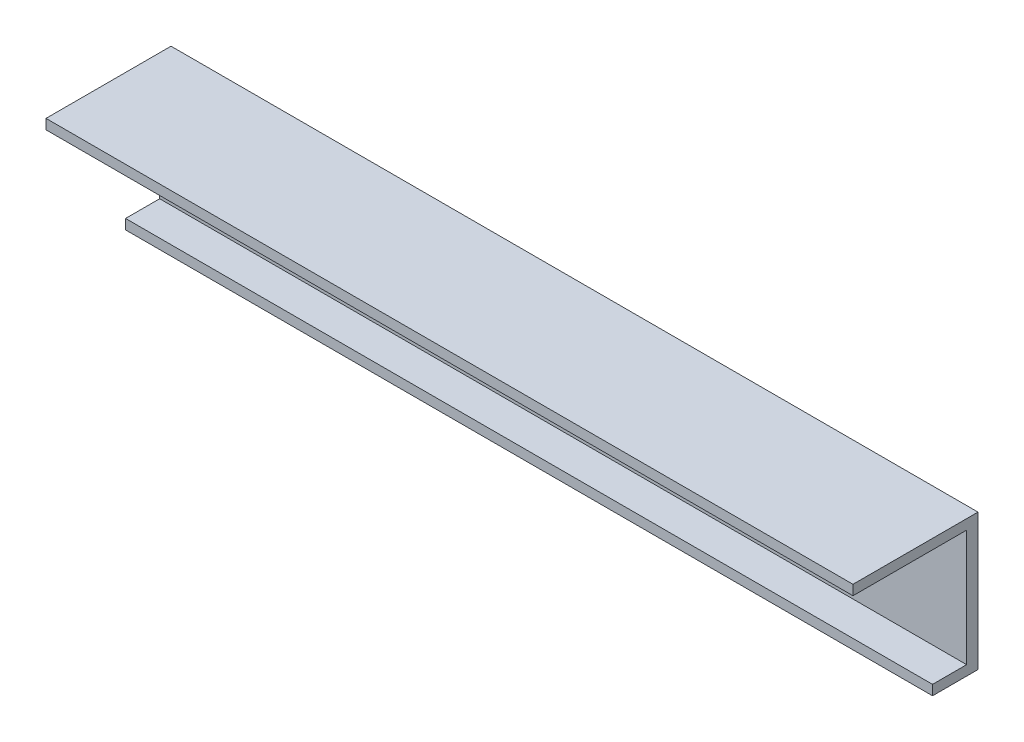
ISO-10303-21;
HEADER;
FILE_DESCRIPTION(('STEP AP214'),'2;1');
FILE_NAME('part.step','',(''),(''),'','','');
FILE_SCHEMA(('AUTOMOTIVE_DESIGN { 1 0 10303 214 1 1 1 1 }'));
ENDSEC;
DATA;
#1=APPLICATION_CONTEXT('core data for automotive mechanical design processes');
#2=APPLICATION_PROTOCOL_DEFINITION('international standard','automotive_design',2000,#1);
#3=PRODUCT_CONTEXT('',#1,'mechanical');
#4=PRODUCT('Part','Part','',(#3));
#5=PRODUCT_RELATED_PRODUCT_CATEGORY('part','',(#4));
#6=PRODUCT_DEFINITION_FORMATION('','',#4);
#7=PRODUCT_DEFINITION_CONTEXT('part definition',#1,'design');
#8=PRODUCT_DEFINITION('design','',#6,#7);
#9=PRODUCT_DEFINITION_SHAPE('','',#8);
#10=(LENGTH_UNIT() NAMED_UNIT(*) SI_UNIT(.MILLI.,.METRE.));
#11=(NAMED_UNIT(*) PLANE_ANGLE_UNIT() SI_UNIT($,.RADIAN.));
#12=(NAMED_UNIT(*) SI_UNIT($,.STERADIAN.) SOLID_ANGLE_UNIT());
#13=UNCERTAINTY_MEASURE_WITH_UNIT(LENGTH_MEASURE(1.E-05),#10,'distance_accuracy_value','');
#14=(GEOMETRIC_REPRESENTATION_CONTEXT(3) GLOBAL_UNCERTAINTY_ASSIGNED_CONTEXT((#13)) GLOBAL_UNIT_ASSIGNED_CONTEXT((#10,
#11,#12)) REPRESENTATION_CONTEXT('',''));
#15=CARTESIAN_POINT('',(0.,0.,0.));
#16=DIRECTION('',(0.,0.,1.));
#17=DIRECTION('',(1.,0.,0.));
#18=AXIS2_PLACEMENT_3D('',#15,#16,#17);
#19=CARTESIAN_POINT('',(-112.361161705183,24.,22.));
#20=DIRECTION('',(1.,0.,0.));
#21=DIRECTION('',(0.,0.,-1.));
#22=AXIS2_PLACEMENT_3D('',#19,#20,#21);
#23=PLANE('',#22);
#24=DIRECTION('',(0.,1.,0.));
#25=VECTOR('',#24,1.);
#26=CARTESIAN_POINT('',(-112.361161705183,22.25,2.));
#27=LINE('',#26,#25);
#28=CARTESIAN_POINT('',(-112.361161705183,1.74999999999998,2.));
#29=VERTEX_POINT('',#28);
#30=CARTESIAN_POINT('',(-112.361161705183,22.25,2.));
#31=VERTEX_POINT('',#30);
#32=EDGE_CURVE('E171',#29,#31,#27,.T.);
#33=ORIENTED_EDGE('',*,*,#32,.T.);
#34=DIRECTION('',(0.,0.,1.));
#35=VECTOR('',#34,1.);
#36=CARTESIAN_POINT('',(-112.361161705183,22.25,22.));
#37=LINE('',#36,#35);
#38=CARTESIAN_POINT('',(-112.361161705183,22.25,22.));
#39=VERTEX_POINT('',#38);
#40=EDGE_CURVE('E193',#31,#39,#37,.T.);
#41=ORIENTED_EDGE('',*,*,#40,.T.);
#42=DIRECTION('',(0.,-1.,0.));
#43=VECTOR('',#42,1.);
#44=CARTESIAN_POINT('',(-112.361161705183,24.,22.));
#45=LINE('',#44,#43);
#46=CARTESIAN_POINT('',(-112.361161705183,24.,22.));
#47=VERTEX_POINT('',#46);
#48=EDGE_CURVE('E94',#47,#39,#45,.T.);
#49=ORIENTED_EDGE('',*,*,#48,.F.);
#50=DIRECTION('',(0.,0.,-1.));
#51=VECTOR('',#50,1.);
#52=CARTESIAN_POINT('',(-112.361161705183,24.,22.));
#53=LINE('',#52,#51);
#54=CARTESIAN_POINT('',(-112.361161705183,24.,0.));
#55=VERTEX_POINT('',#54);
#56=EDGE_CURVE('E86',#47,#55,#53,.T.);
#57=ORIENTED_EDGE('',*,*,#56,.T.);
#58=DIRECTION('',(0.,-1.,0.));
#59=VECTOR('',#58,1.);
#60=CARTESIAN_POINT('',(-112.361161705183,24.,0.));
#61=LINE('',#60,#59);
#62=CARTESIAN_POINT('',(-112.361161705183,0.,0.));
#63=VERTEX_POINT('',#62);
#64=EDGE_CURVE('E101',#55,#63,#61,.T.);
#65=ORIENTED_EDGE('',*,*,#64,.T.);
#66=DIRECTION('',(0.,0.,-1.));
#67=VECTOR('',#66,1.);
#68=CARTESIAN_POINT('',(-112.361161705183,0.,22.));
#69=LINE('',#68,#67);
#70=CARTESIAN_POINT('',(-112.361161705183,0.,8.));
#71=VERTEX_POINT('',#70);
#72=EDGE_CURVE('E11',#71,#63,#69,.T.);
#73=ORIENTED_EDGE('',*,*,#72,.F.);
#74=DIRECTION('',(0.,1.,0.));
#75=VECTOR('',#74,1.);
#76=CARTESIAN_POINT('',(-112.361161705183,1.74999999999998,8.));
#77=LINE('',#76,#75);
#78=CARTESIAN_POINT('',(-112.361161705183,1.74999999999998,8.));
#79=VERTEX_POINT('',#78);
#80=EDGE_CURVE('E143',#71,#79,#77,.T.);
#81=ORIENTED_EDGE('',*,*,#80,.T.);
#82=DIRECTION('',(0.,0.,-1.));
#83=VECTOR('',#82,1.);
#84=CARTESIAN_POINT('',(-112.361161705183,1.74999999999998,2.));
#85=LINE('',#84,#83);
#86=EDGE_CURVE('E204',#79,#29,#85,.T.);
#87=ORIENTED_EDGE('',*,*,#86,.T.);
#88=EDGE_LOOP('',(#33,#41,#49,#57,#65,#73,#81,#87));
#89=FACE_BOUND('',#88,.T.);
#90=ADVANCED_FACE('F41',(#89),#23,.F.);
#91=CARTESIAN_POINT('',(-112.361161705183,0.,22.));
#92=DIRECTION('',(0.,1.,0.));
#93=DIRECTION('',(0.,0.,1.));
#94=AXIS2_PLACEMENT_3D('',#91,#92,#93);
#95=PLANE('',#94);
#96=DIRECTION('',(0.,0.,-1.));
#97=VECTOR('',#96,1.);
#98=CARTESIAN_POINT('',(29.6388382948165,0.,22.));
#99=LINE('',#98,#97);
#100=CARTESIAN_POINT('',(29.6388382948165,0.,8.));
#101=VERTEX_POINT('',#100);
#102=CARTESIAN_POINT('',(29.6388382948165,0.,0.));
#103=VERTEX_POINT('',#102);
#104=EDGE_CURVE('E49',#101,#103,#99,.T.);
#105=ORIENTED_EDGE('',*,*,#104,.F.);
#106=DIRECTION('',(1.,0.,0.));
#107=VECTOR('',#106,1.);
#108=CARTESIAN_POINT('',(-112.361161705183,0.,8.));
#109=LINE('',#108,#107);
#110=EDGE_CURVE('E138',#71,#101,#109,.T.);
#111=ORIENTED_EDGE('',*,*,#110,.F.);
#112=ORIENTED_EDGE('',*,*,#72,.T.);
#113=DIRECTION('',(1.,0.,0.));
#114=VECTOR('',#113,1.);
#115=CARTESIAN_POINT('',(-112.361161705183,0.,0.));
#116=LINE('',#115,#114);
#117=EDGE_CURVE('E108',#63,#103,#116,.T.);
#118=ORIENTED_EDGE('',*,*,#117,.T.);
#119=EDGE_LOOP('',(#105,#111,#112,#118));
#120=FACE_BOUND('',#119,.T.);
#121=ADVANCED_FACE('F135',(#120),#95,.F.);
#122=CARTESIAN_POINT('',(29.6388382948165,24.,22.));
#123=DIRECTION('',(-1.,0.,0.));
#124=DIRECTION('',(0.,-1.,0.));
#125=AXIS2_PLACEMENT_3D('',#122,#123,#124);
#126=PLANE('',#125);
#127=DIRECTION('',(0.,1.,0.));
#128=VECTOR('',#127,1.);
#129=CARTESIAN_POINT('',(29.6388382948165,24.,22.));
#130=LINE('',#129,#128);
#131=CARTESIAN_POINT('',(29.6388382948165,22.25,22.));
#132=VERTEX_POINT('',#131);
#133=CARTESIAN_POINT('',(29.6388382948165,24.,22.));
#134=VERTEX_POINT('',#133);
#135=EDGE_CURVE('E195',#132,#134,#130,.T.);
#136=ORIENTED_EDGE('',*,*,#135,.F.);
#137=DIRECTION('',(0.,0.,1.));
#138=VECTOR('',#137,1.);
#139=CARTESIAN_POINT('',(29.6388382948165,22.25,22.));
#140=LINE('',#139,#138);
#141=CARTESIAN_POINT('',(29.6388382948165,22.25,2.));
#142=VERTEX_POINT('',#141);
#143=EDGE_CURVE('E56',#142,#132,#140,.T.);
#144=ORIENTED_EDGE('',*,*,#143,.F.);
#145=DIRECTION('',(0.,1.,0.));
#146=VECTOR('',#145,1.);
#147=CARTESIAN_POINT('',(29.6388382948165,22.25,2.));
#148=LINE('',#147,#146);
#149=CARTESIAN_POINT('',(29.6388382948165,1.75,2.));
#150=VERTEX_POINT('',#149);
#151=EDGE_CURVE('E170',#150,#142,#148,.T.);
#152=ORIENTED_EDGE('',*,*,#151,.F.);
#153=DIRECTION('',(0.,0.,-1.));
#154=VECTOR('',#153,1.);
#155=CARTESIAN_POINT('',(29.6388382948165,1.75,2.));
#156=LINE('',#155,#154);
#157=CARTESIAN_POINT('',(29.6388382948165,1.75,8.));
#158=VERTEX_POINT('',#157);
#159=EDGE_CURVE('E177',#158,#150,#156,.T.);
#160=ORIENTED_EDGE('',*,*,#159,.F.);
#161=DIRECTION('',(0.,1.,0.));
#162=VECTOR('',#161,1.);
#163=CARTESIAN_POINT('',(29.6388382948165,1.75,8.));
#164=LINE('',#163,#162);
#165=EDGE_CURVE('E132',#101,#158,#164,.T.);
#166=ORIENTED_EDGE('',*,*,#165,.F.);
#167=ORIENTED_EDGE('',*,*,#104,.T.);
#168=DIRECTION('',(0.,1.,0.));
#169=VECTOR('',#168,1.);
#170=CARTESIAN_POINT('',(29.6388382948165,24.,0.));
#171=LINE('',#170,#169);
#172=CARTESIAN_POINT('',(29.6388382948165,24.,0.));
#173=VERTEX_POINT('',#172);
#174=EDGE_CURVE('E95',#103,#173,#171,.T.);
#175=ORIENTED_EDGE('',*,*,#174,.T.);
#176=DIRECTION('',(0.,0.,-1.));
#177=VECTOR('',#176,1.);
#178=CARTESIAN_POINT('',(29.6388382948165,24.,22.));
#179=LINE('',#178,#177);
#180=EDGE_CURVE('E89',#134,#173,#179,.T.);
#181=ORIENTED_EDGE('',*,*,#180,.F.);
#182=EDGE_LOOP('',(#136,#144,#152,#160,#166,#167,#175,#181));
#183=FACE_BOUND('',#182,.T.);
#184=ADVANCED_FACE('F128',(#183),#126,.F.);
#185=CARTESIAN_POINT('',(-112.361161705183,24.,22.));
#186=DIRECTION('',(0.,-1.,0.));
#187=DIRECTION('',(0.,0.,-1.));
#188=AXIS2_PLACEMENT_3D('',#185,#186,#187);
#189=PLANE('',#188);
#190=DIRECTION('',(-1.,0.,0.));
#191=VECTOR('',#190,1.);
#192=CARTESIAN_POINT('',(-112.361161705183,24.,0.));
#193=LINE('',#192,#191);
#194=EDGE_CURVE('E83',#173,#55,#193,.T.);
#195=ORIENTED_EDGE('',*,*,#194,.T.);
#196=ORIENTED_EDGE('',*,*,#56,.F.);
#197=DIRECTION('',(-1.,0.,0.));
#198=VECTOR('',#197,1.);
#199=CARTESIAN_POINT('',(-112.361161705183,24.,22.));
#200=LINE('',#199,#198);
#201=EDGE_CURVE('E65',#134,#47,#200,.T.);
#202=ORIENTED_EDGE('',*,*,#201,.F.);
#203=ORIENTED_EDGE('',*,*,#180,.T.);
#204=EDGE_LOOP('',(#195,#196,#202,#203));
#205=FACE_BOUND('',#204,.T.);
#206=ADVANCED_FACE('F85',(#205),#189,.F.);
#207=CARTESIAN_POINT('',(0.,0.,22.));
#208=DIRECTION('',(0.,0.,1.));
#209=DIRECTION('',(1.,0.,0.));
#210=AXIS2_PLACEMENT_3D('',#207,#208,#209);
#211=PLANE('',#210);
#212=DIRECTION('',(1.,0.,0.));
#213=VECTOR('',#212,1.);
#214=CARTESIAN_POINT('',(-112.361161705183,22.25,22.));
#215=LINE('',#214,#213);
#216=EDGE_CURVE('E110',#39,#132,#215,.T.);
#217=ORIENTED_EDGE('',*,*,#216,.T.);
#218=ORIENTED_EDGE('',*,*,#135,.T.);
#219=ORIENTED_EDGE('',*,*,#201,.T.);
#220=ORIENTED_EDGE('',*,*,#48,.T.);
#221=EDGE_LOOP('',(#217,#218,#219,#220));
#222=FACE_BOUND('',#221,.T.);
#223=ADVANCED_FACE('F198',(#222),#211,.T.);
#224=CARTESIAN_POINT('',(0.,0.,0.));
#225=DIRECTION('',(0.,0.,1.));
#226=DIRECTION('',(1.,0.,0.));
#227=AXIS2_PLACEMENT_3D('',#224,#225,#226);
#228=PLANE('',#227);
#229=ORIENTED_EDGE('',*,*,#64,.F.);
#230=ORIENTED_EDGE('',*,*,#194,.F.);
#231=ORIENTED_EDGE('',*,*,#174,.F.);
#232=ORIENTED_EDGE('',*,*,#117,.F.);
#233=EDGE_LOOP('',(#229,#230,#231,#232));
#234=FACE_BOUND('',#233,.T.);
#235=ADVANCED_FACE('F106',(#234),#228,.F.);
#236=CARTESIAN_POINT('',(-112.361161705183,22.25,22.));
#237=DIRECTION('',(0.,1.,0.));
#238=DIRECTION('',(-1.,0.,0.));
#239=AXIS2_PLACEMENT_3D('',#236,#237,#238);
#240=PLANE('',#239);
#241=ORIENTED_EDGE('',*,*,#143,.T.);
#242=ORIENTED_EDGE('',*,*,#216,.F.);
#243=ORIENTED_EDGE('',*,*,#40,.F.);
#244=DIRECTION('',(1.,0.,0.));
#245=VECTOR('',#244,1.);
#246=CARTESIAN_POINT('',(-112.361161705183,22.25,2.));
#247=LINE('',#246,#245);
#248=EDGE_CURVE('E115',#31,#142,#247,.T.);
#249=ORIENTED_EDGE('',*,*,#248,.T.);
#250=EDGE_LOOP('',(#241,#242,#243,#249));
#251=FACE_BOUND('',#250,.T.);
#252=ADVANCED_FACE('F200',(#251),#240,.F.);
#253=CARTESIAN_POINT('',(-112.361161705183,22.25,2.));
#254=DIRECTION('',(0.,0.,-1.));
#255=DIRECTION('',(0.,1.,0.));
#256=AXIS2_PLACEMENT_3D('',#253,#254,#255);
#257=PLANE('',#256);
#258=ORIENTED_EDGE('',*,*,#151,.T.);
#259=ORIENTED_EDGE('',*,*,#248,.F.);
#260=ORIENTED_EDGE('',*,*,#32,.F.);
#261=DIRECTION('',(1.,0.,0.));
#262=VECTOR('',#261,1.);
#263=CARTESIAN_POINT('',(-112.361161705183,1.74999999999998,2.));
#264=LINE('',#263,#262);
#265=EDGE_CURVE('E166',#29,#150,#264,.T.);
#266=ORIENTED_EDGE('',*,*,#265,.T.);
#267=EDGE_LOOP('',(#258,#259,#260,#266));
#268=FACE_BOUND('',#267,.T.);
#269=ADVANCED_FACE('F168',(#268),#257,.F.);
#270=CARTESIAN_POINT('',(-112.361161705183,1.74999999999998,2.));
#271=DIRECTION('',(0.,-1.,0.));
#272=DIRECTION('',(1.,0.,0.));
#273=AXIS2_PLACEMENT_3D('',#270,#271,#272);
#274=PLANE('',#273);
#275=ORIENTED_EDGE('',*,*,#159,.T.);
#276=ORIENTED_EDGE('',*,*,#265,.F.);
#277=ORIENTED_EDGE('',*,*,#86,.F.);
#278=DIRECTION('',(1.,0.,0.));
#279=VECTOR('',#278,1.);
#280=CARTESIAN_POINT('',(-112.361161705183,1.74999999999998,8.));
#281=LINE('',#280,#279);
#282=EDGE_CURVE('E175',#79,#158,#281,.T.);
#283=ORIENTED_EDGE('',*,*,#282,.T.);
#284=EDGE_LOOP('',(#275,#276,#277,#283));
#285=FACE_BOUND('',#284,.T.);
#286=ADVANCED_FACE('F178',(#285),#274,.F.);
#287=CARTESIAN_POINT('',(-112.361161705183,1.74999999999998,8.));
#288=DIRECTION('',(0.,0.,-1.));
#289=DIRECTION('',(-1.,0.,0.));
#290=AXIS2_PLACEMENT_3D('',#287,#288,#289);
#291=PLANE('',#290);
#292=ORIENTED_EDGE('',*,*,#165,.T.);
#293=ORIENTED_EDGE('',*,*,#282,.F.);
#294=ORIENTED_EDGE('',*,*,#80,.F.);
#295=ORIENTED_EDGE('',*,*,#110,.T.);
#296=EDGE_LOOP('',(#292,#293,#294,#295));
#297=FACE_BOUND('',#296,.T.);
#298=ADVANCED_FACE('F208',(#297),#291,.F.);
#299=CLOSED_SHELL('',(#90,#121,#184,#206,#223,#235,#252,#269,#286,#298));
#300=MANIFOLD_SOLID_BREP('B2',#299);
#301=ADVANCED_BREP_SHAPE_REPRESENTATION('',(#18,#300),#14);
#302=SHAPE_DEFINITION_REPRESENTATION(#9,#301);
ENDSEC;
END-ISO-10303-21;
